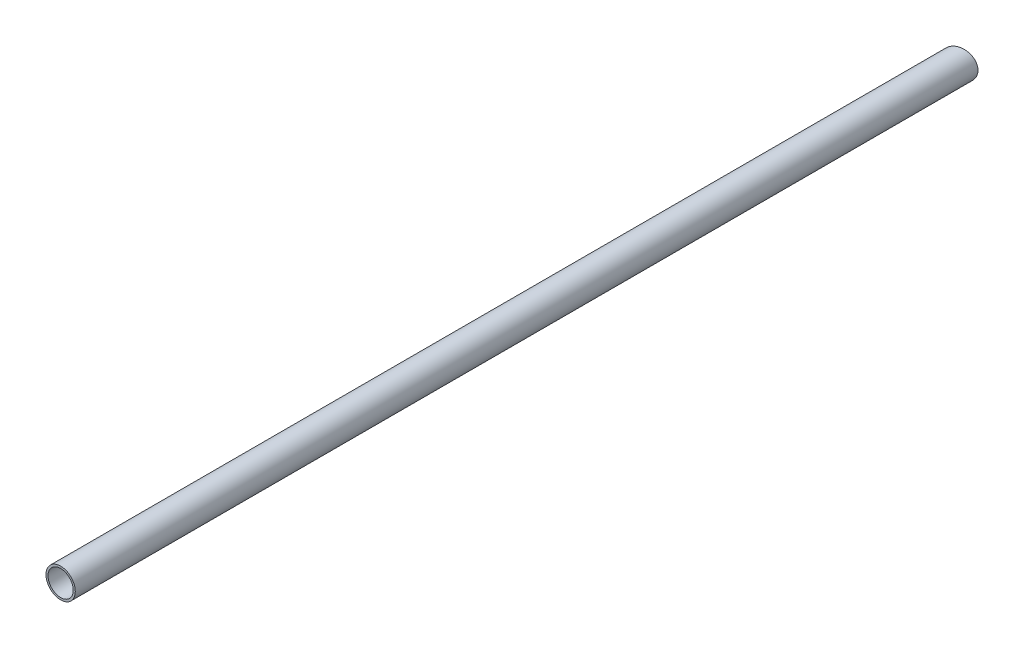
ISO-10303-21;
HEADER;
FILE_DESCRIPTION(('STEP AP214'),'2;1');
FILE_NAME('part.step','',(''),(''),'','','');
FILE_SCHEMA(('AUTOMOTIVE_DESIGN { 1 0 10303 214 1 1 1 1 }'));
ENDSEC;
DATA;
#1=APPLICATION_CONTEXT('core data for automotive mechanical design processes');
#2=APPLICATION_PROTOCOL_DEFINITION('international standard','automotive_design',2000,#1);
#3=PRODUCT_CONTEXT('',#1,'mechanical');
#4=PRODUCT('Part','Part','',(#3));
#5=PRODUCT_RELATED_PRODUCT_CATEGORY('part','',(#4));
#6=PRODUCT_DEFINITION_FORMATION('','',#4);
#7=PRODUCT_DEFINITION_CONTEXT('part definition',#1,'design');
#8=PRODUCT_DEFINITION('design','',#6,#7);
#9=PRODUCT_DEFINITION_SHAPE('','',#8);
#10=(LENGTH_UNIT() NAMED_UNIT(*) SI_UNIT(.MILLI.,.METRE.));
#11=(NAMED_UNIT(*) PLANE_ANGLE_UNIT() SI_UNIT($,.RADIAN.));
#12=(NAMED_UNIT(*) SI_UNIT($,.STERADIAN.) SOLID_ANGLE_UNIT());
#13=UNCERTAINTY_MEASURE_WITH_UNIT(LENGTH_MEASURE(1.E-05),#10,'distance_accuracy_value','');
#14=(GEOMETRIC_REPRESENTATION_CONTEXT(3) GLOBAL_UNCERTAINTY_ASSIGNED_CONTEXT((#13)) GLOBAL_UNIT_ASSIGNED_CONTEXT((#10,
#11,#12)) REPRESENTATION_CONTEXT('',''));
#15=CARTESIAN_POINT('',(0.,0.,0.));
#16=DIRECTION('',(0.,0.,1.));
#17=DIRECTION('',(1.,0.,0.));
#18=AXIS2_PLACEMENT_3D('',#15,#16,#17);
#19=CARTESIAN_POINT('',(0.,0.,782.32));
#20=DIRECTION('',(0.,0.,1.));
#21=DIRECTION('',(1.,0.,0.));
#22=AXIS2_PLACEMENT_3D('',#19,#20,#21);
#23=PLANE('',#22);
#24=CARTESIAN_POINT('',(0.,0.,782.32));
#25=DIRECTION('',(0.,0.,1.));
#26=DIRECTION('',(1.,0.,0.));
#27=AXIS2_PLACEMENT_3D('',#24,#25,#26);
#28=CIRCLE('',#27,12.7);
#29=CARTESIAN_POINT('',(12.7,0.,782.32));
#30=VERTEX_POINT('',#29);
#31=EDGE_CURVE('E10',#30,#30,#28,.T.);
#32=ORIENTED_EDGE('',*,*,#31,.T.);
#33=EDGE_LOOP('',(#32));
#34=FACE_BOUND('',#33,.T.);
#35=CARTESIAN_POINT('',(0.,0.,782.32));
#36=DIRECTION('',(0.,0.,1.));
#37=DIRECTION('',(1.,0.,0.));
#38=AXIS2_PLACEMENT_3D('',#35,#36,#37);
#39=CIRCLE('',#38,10.922);
#40=CARTESIAN_POINT('',(10.922,0.,782.32));
#41=VERTEX_POINT('',#40);
#42=EDGE_CURVE('E48',#41,#41,#39,.T.);
#43=ORIENTED_EDGE('',*,*,#42,.F.);
#44=EDGE_LOOP('',(#43));
#45=FACE_BOUND('',#44,.T.);
#46=ADVANCED_FACE('F40',(#34,#45),#23,.T.);
#47=CARTESIAN_POINT('',(0.,0.,782.32));
#48=DIRECTION('',(0.,0.,-1.));
#49=DIRECTION('',(-1.,0.,0.));
#50=AXIS2_PLACEMENT_3D('',#47,#48,#49);
#51=CYLINDRICAL_SURFACE('',#50,12.7);
#52=ORIENTED_EDGE('',*,*,#31,.F.);
#53=EDGE_LOOP('',(#52));
#54=FACE_BOUND('',#53,.T.);
#55=CARTESIAN_POINT('',(0.,0.,3.4029547438752));
#56=DIRECTION('',(0.258819045102515,0.,0.96592582628907));
#57=DIRECTION('',(0.96592582628907,0.,-0.258819045102515));
#58=AXIS2_PLACEMENT_3D('',#55,#56,#57);
#59=ELLIPSE('',#58,13.148007491208,12.7);
#60=CARTESIAN_POINT('',(12.7,0.,0.));
#61=VERTEX_POINT('',#60);
#62=EDGE_CURVE('E52',#61,#61,#59,.T.);
#63=ORIENTED_EDGE('',*,*,#62,.T.);
#64=EDGE_LOOP('',(#63));
#65=FACE_BOUND('',#64,.T.);
#66=ADVANCED_FACE('F42',(#54,#65),#51,.T.);
#67=CARTESIAN_POINT('',(0.,0.,782.32));
#68=DIRECTION('',(0.,0.,-1.));
#69=DIRECTION('',(-1.,0.,0.));
#70=AXIS2_PLACEMENT_3D('',#67,#68,#69);
#71=CYLINDRICAL_SURFACE('',#70,10.922);
#72=CARTESIAN_POINT('',(0.,0.,3.4029547438752));
#73=DIRECTION('',(0.258819045102515,0.,0.96592582628907));
#74=DIRECTION('',(0.96592582628907,0.,-0.258819045102515));
#75=AXIS2_PLACEMENT_3D('',#72,#73,#74);
#76=ELLIPSE('',#75,11.3072864424389,10.922);
#77=CARTESIAN_POINT('',(10.922,0.,0.47641366414255));
#78=VERTEX_POINT('',#77);
#79=EDGE_CURVE('E44',#78,#78,#76,.T.);
#80=ORIENTED_EDGE('',*,*,#79,.F.);
#81=EDGE_LOOP('',(#80));
#82=FACE_BOUND('',#81,.T.);
#83=ORIENTED_EDGE('',*,*,#42,.T.);
#84=EDGE_LOOP('',(#83));
#85=FACE_BOUND('',#84,.T.);
#86=ADVANCED_FACE('F64',(#82,#85),#71,.F.);
#87=CARTESIAN_POINT('',(12.7,-12.7,0.));
#88=DIRECTION('',(0.258819045102515,0.,0.96592582628907));
#89=DIRECTION('',(0.96592582628907,0.,-0.258819045102515));
#90=AXIS2_PLACEMENT_3D('',#87,#88,#89);
#91=PLANE('',#90);
#92=ORIENTED_EDGE('',*,*,#79,.T.);
#93=EDGE_LOOP('',(#92));
#94=FACE_BOUND('',#93,.T.);
#95=ORIENTED_EDGE('',*,*,#62,.F.);
#96=EDGE_LOOP('',(#95));
#97=FACE_BOUND('',#96,.T.);
#98=ADVANCED_FACE('F61',(#94,#97),#91,.F.);
#99=CLOSED_SHELL('',(#46,#66,#86,#98));
#100=MANIFOLD_SOLID_BREP('B2',#99);
#101=ADVANCED_BREP_SHAPE_REPRESENTATION('',(#18,#100),#14);
#102=SHAPE_DEFINITION_REPRESENTATION(#9,#101);
ENDSEC;
END-ISO-10303-21;
